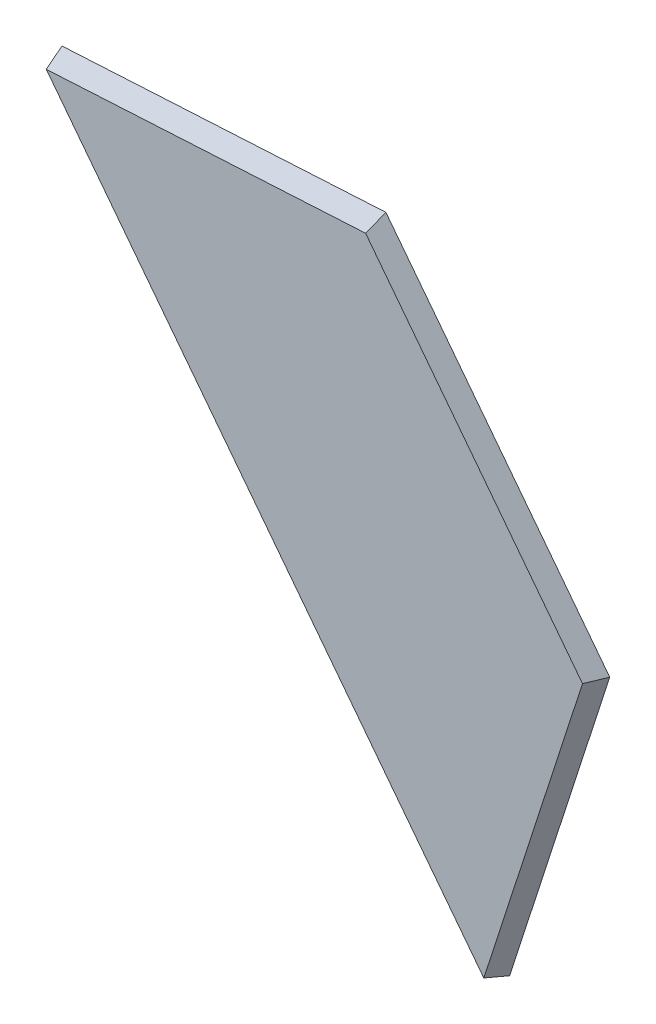
ISO-10303-21;
HEADER;
FILE_DESCRIPTION(('STEP AP214'),'2;1');
FILE_NAME('part.step','',(''),(''),'','','');
FILE_SCHEMA(('AUTOMOTIVE_DESIGN { 1 0 10303 214 1 1 1 1 }'));
ENDSEC;
DATA;
#1=APPLICATION_CONTEXT('core data for automotive mechanical design processes');
#2=APPLICATION_PROTOCOL_DEFINITION('international standard','automotive_design',2000,#1);
#3=PRODUCT_CONTEXT('',#1,'mechanical');
#4=PRODUCT('Part','Part','',(#3));
#5=PRODUCT_RELATED_PRODUCT_CATEGORY('part','',(#4));
#6=PRODUCT_DEFINITION_FORMATION('','',#4);
#7=PRODUCT_DEFINITION_CONTEXT('part definition',#1,'design');
#8=PRODUCT_DEFINITION('design','',#6,#7);
#9=PRODUCT_DEFINITION_SHAPE('','',#8);
#10=(LENGTH_UNIT() NAMED_UNIT(*) SI_UNIT(.MILLI.,.METRE.));
#11=(NAMED_UNIT(*) PLANE_ANGLE_UNIT() SI_UNIT($,.RADIAN.));
#12=(NAMED_UNIT(*) SI_UNIT($,.STERADIAN.) SOLID_ANGLE_UNIT());
#13=UNCERTAINTY_MEASURE_WITH_UNIT(LENGTH_MEASURE(1.E-05),#10,'distance_accuracy_value','');
#14=(GEOMETRIC_REPRESENTATION_CONTEXT(3) GLOBAL_UNCERTAINTY_ASSIGNED_CONTEXT((#13)) GLOBAL_UNIT_ASSIGNED_CONTEXT((#10,
#11,#12)) REPRESENTATION_CONTEXT('',''));
#15=CARTESIAN_POINT('',(0.,0.,0.));
#16=DIRECTION('',(0.,0.,1.));
#17=DIRECTION('',(1.,0.,0.));
#18=AXIS2_PLACEMENT_3D('',#15,#16,#17);
#19=CARTESIAN_POINT('',(0.,0.,60.));
#20=DIRECTION('',(0.,0.,-1.));
#21=DIRECTION('',(-1.,0.,0.));
#22=AXIS2_PLACEMENT_3D('',#19,#20,#21);
#23=PLANE('',#22);
#24=DIRECTION('',(0.308545213831799,0.951209677737506,0.));
#25=VECTOR('',#24,1.);
#26=CARTESIAN_POINT('',(523.22907497545,-169.720547004217,60.));
#27=LINE('',#26,#25);
#28=CARTESIAN_POINT('',(276.3644984007,-930.775860137303,60.));
#29=VERTEX_POINT('',#28);
#30=CARTESIAN_POINT('',(525.748793655985,-161.952541905921,60.));
#31=VERTEX_POINT('',#30);
#32=EDGE_CURVE('E103',#29,#31,#27,.T.);
#33=ORIENTED_EDGE('',*,*,#32,.T.);
#34=DIRECTION('',(-0.610109647488104,0.792316993407274,0.));
#35=VECTOR('',#34,1.);
#36=CARTESIAN_POINT('',(534.560808216033,-173.396237167623,60.));
#37=LINE('',#36,#35);
#38=CARTESIAN_POINT('',(-22.2299257417183,549.678315255409,60.));
#39=VERTEX_POINT('',#38);
#40=EDGE_CURVE('E52',#31,#39,#37,.T.);
#41=ORIENTED_EDGE('',*,*,#40,.T.);
#42=DIRECTION('',(-0.998473286091908,-0.0552367356098018,0.));
#43=VECTOR('',#42,1.);
#44=CARTESIAN_POINT('',(-30.3839066761003,549.22722728409,60.));
#45=LINE('',#44,#43);
#46=CARTESIAN_POINT('',(-829.254457708692,505.032753552539,60.));
#47=VERTEX_POINT('',#46);
#48=EDGE_CURVE('E59',#39,#47,#45,.T.);
#49=ORIENTED_EDGE('',*,*,#48,.T.);
#50=DIRECTION('',(0.610109647488099,-0.792316993407277,0.));
#51=VECTOR('',#50,1.);
#52=CARTESIAN_POINT('',(-276.444979653998,-212.87155329238,60.));
#53=LINE('',#52,#51);
#54=EDGE_CURVE('E105',#47,#29,#53,.T.);
#55=ORIENTED_EDGE('',*,*,#54,.T.);
#56=EDGE_LOOP('',(#33,#41,#49,#55));
#57=FACE_BOUND('',#56,.T.);
#58=ADVANCED_FACE('F38',(#57),#23,.F.);
#59=CARTESIAN_POINT('',(0.,0.,0.));
#60=DIRECTION('',(0.,0.,-1.));
#61=DIRECTION('',(-1.,0.,0.));
#62=AXIS2_PLACEMENT_3D('',#59,#60,#61);
#63=PLANE('',#62);
#64=DIRECTION('',(-0.610109647488104,0.792316993407274,0.));
#65=VECTOR('',#64,1.);
#66=CARTESIAN_POINT('',(534.560808216033,-173.396237167623,0.));
#67=LINE('',#66,#65);
#68=CARTESIAN_POINT('',(534.560808216033,-173.396237167623,0.));
#69=VERTEX_POINT('',#68);
#70=CARTESIAN_POINT('',(-31.0419403017603,561.122010517103,0.));
#71=VERTEX_POINT('',#70);
#72=EDGE_CURVE('E78',#69,#71,#67,.T.);
#73=ORIENTED_EDGE('',*,*,#72,.F.);
#74=DIRECTION('',(0.308545213831799,0.951209677737506,0.));
#75=VECTOR('',#74,1.);
#76=CARTESIAN_POINT('',(787.506047005333,606.405063542784,0.));
#77=LINE('',#76,#75);
#78=CARTESIAN_POINT('',(281.615569426732,-953.197537878031,0.));
#79=VERTEX_POINT('',#78);
#80=EDGE_CURVE('E89',#79,#69,#77,.T.);
#81=ORIENTED_EDGE('',*,*,#80,.F.);
#82=DIRECTION('',(0.610109647488099,-0.792316993407277,0.));
#83=VECTOR('',#82,1.);
#84=CARTESIAN_POINT('',(281.615569426732,-953.197537878031,0.));
#85=LINE('',#84,#83);
#86=CARTESIAN_POINT('',(-849.589927608854,515.838957491439,0.));
#87=VERTEX_POINT('',#86);
#88=EDGE_CURVE('E95',#87,#79,#85,.T.);
#89=ORIENTED_EDGE('',*,*,#88,.F.);
#90=DIRECTION('',(-0.998473286091908,-0.0552367356098018,0.));
#91=VECTOR('',#90,1.);
#92=CARTESIAN_POINT('',(-849.589927608854,515.838957491439,0.));
#93=LINE('',#92,#91);
#94=EDGE_CURVE('E91',#71,#87,#93,.T.);
#95=ORIENTED_EDGE('',*,*,#94,.F.);
#96=EDGE_LOOP('',(#73,#81,#89,#95));
#97=FACE_BOUND('',#96,.T.);
#98=ADVANCED_FACE('F87',(#97),#63,.T.);
#99=CARTESIAN_POINT('',(-30.3839066761003,549.22722728409,60.));
#100=DIRECTION('',(0.054179135509839,-0.979355837612682,-0.19474795148953));
#101=DIRECTION('',(-0.998473286091908,-0.0552367356098018,0.));
#102=AXIS2_PLACEMENT_3D('',#99,#100,#101);
#103=PLANE('',#102);
#104=DIRECTION('',(-0.142788084622392,0.185431301354078,-0.972227748713233));
#105=VECTOR('',#104,1.);
#106=CARTESIAN_POINT('',(-22.3842290414085,549.878700754944,58.9493664679826));
#107=LINE('',#106,#105);
#108=EDGE_CURVE('E98',#71,#39,#107,.F.);
#109=ORIENTED_EDGE('',*,*,#108,.F.);
#110=ORIENTED_EDGE('',*,*,#94,.T.);
#111=DIRECTION('',(0.316419420475128,-0.16814427228237,0.933598550794085));
#112=VECTOR('',#111,1.);
#113=CARTESIAN_POINT('',(-751.621867610542,463.779042424922,289.055705560655));
#114=LINE('',#113,#112);
#115=EDGE_CURVE('E46',#87,#47,#114,.T.);
#116=ORIENTED_EDGE('',*,*,#115,.T.);
#117=ORIENTED_EDGE('',*,*,#48,.F.);
#118=EDGE_LOOP('',(#109,#110,#116,#117));
#119=FACE_BOUND('',#118,.T.);
#120=ADVANCED_FACE('F110',(#119),#103,.F.);
#121=CARTESIAN_POINT('',(523.22907497545,-169.720547004217,60.));
#122=DIRECTION('',(-0.932997170442229,0.30263759736263,-0.194747951489534));
#123=DIRECTION('',(0.308545213831799,0.951209677737506,0.));
#124=AXIS2_PLACEMENT_3D('',#121,#122,#123);
#125=PLANE('',#124);
#126=DIRECTION('',(-0.142788084622393,0.18543130135408,0.972227748713232));
#127=VECTOR('',#126,1.);
#128=CARTESIAN_POINT('',(525.903096955675,-162.152927405457,58.9493664679822));
#129=LINE('',#128,#127);
#130=EDGE_CURVE('E11',#31,#69,#129,.F.);
#131=ORIENTED_EDGE('',*,*,#130,.F.);
#132=ORIENTED_EDGE('',*,*,#32,.F.);
#133=DIRECTION('',(0.0817065383336703,-0.348880764085259,-0.933598550794084));
#134=VECTOR('',#133,1.);
#135=CARTESIAN_POINT('',(256.318035420419,-845.1789732247,289.055705560657));
#136=LINE('',#135,#134);
#137=EDGE_CURVE('E94',#29,#79,#136,.T.);
#138=ORIENTED_EDGE('',*,*,#137,.T.);
#139=ORIENTED_EDGE('',*,*,#80,.T.);
#140=EDGE_LOOP('',(#131,#132,#138,#139));
#141=FACE_BOUND('',#140,.T.);
#142=ADVANCED_FACE('F93',(#141),#125,.F.);
#143=CARTESIAN_POINT('',(-276.444979653998,-212.87155329238,60.));
#144=DIRECTION('',(0.782529780721693,0.602573177954846,-0.156693035879251));
#145=DIRECTION('',(0.610109647488099,-0.792316993407277,0.));
#146=AXIS2_PLACEMENT_3D('',#143,#144,#145);
#147=PLANE('',#146);
#148=ORIENTED_EDGE('',*,*,#115,.F.);
#149=ORIENTED_EDGE('',*,*,#88,.T.);
#150=ORIENTED_EDGE('',*,*,#137,.F.);
#151=ORIENTED_EDGE('',*,*,#54,.F.);
#152=EDGE_LOOP('',(#148,#149,#150,#151));
#153=FACE_BOUND('',#152,.T.);
#154=ADVANCED_FACE('F40',(#153),#147,.F.);
#155=CARTESIAN_POINT('',(534.560808216033,-173.396237167623,60.));
#156=DIRECTION('',(-0.792316993407274,-0.610109647488104,0.));
#157=DIRECTION('',(0.610109647488104,-0.792316993407274,0.));
#158=AXIS2_PLACEMENT_3D('',#155,#156,#157);
#159=PLANE('',#158);
#160=ORIENTED_EDGE('',*,*,#108,.T.);
#161=ORIENTED_EDGE('',*,*,#40,.F.);
#162=ORIENTED_EDGE('',*,*,#130,.T.);
#163=ORIENTED_EDGE('',*,*,#72,.T.);
#164=EDGE_LOOP('',(#160,#161,#162,#163));
#165=FACE_BOUND('',#164,.T.);
#166=ADVANCED_FACE('F77',(#165),#159,.F.);
#167=CLOSED_SHELL('',(#58,#98,#120,#142,#154,#166));
#168=MANIFOLD_SOLID_BREP('B2',#167);
#169=ADVANCED_BREP_SHAPE_REPRESENTATION('',(#18,#168),#14);
#170=SHAPE_DEFINITION_REPRESENTATION(#9,#169);
ENDSEC;
END-ISO-10303-21;
